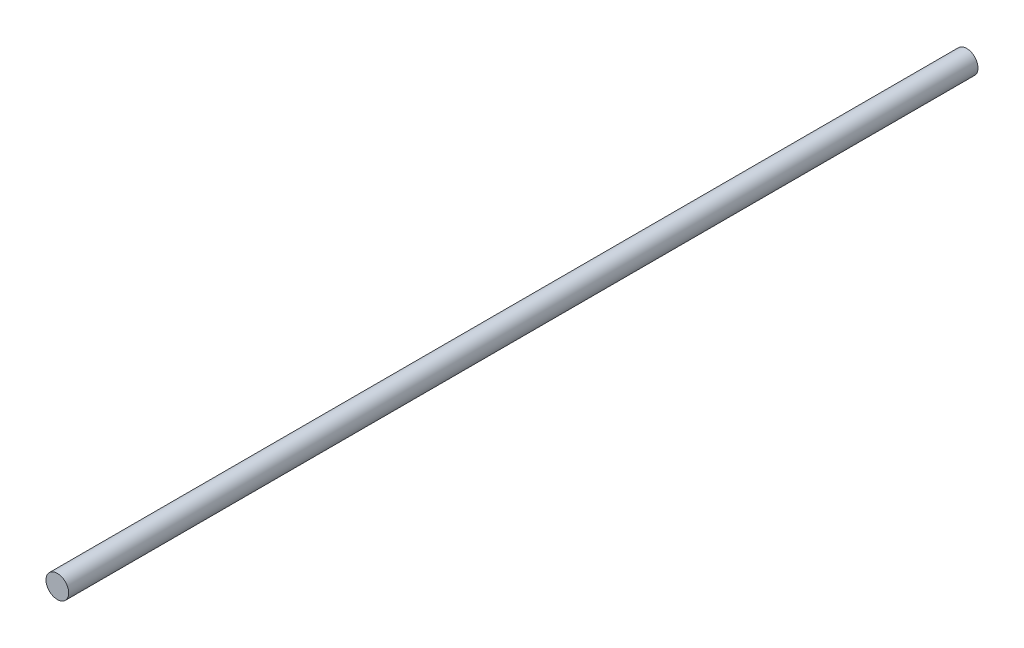
ISO-10303-21;
HEADER;
FILE_DESCRIPTION(('STEP AP214'),'2;1');
FILE_NAME('part.step','',(''),(''),'','','');
FILE_SCHEMA(('AUTOMOTIVE_DESIGN { 1 0 10303 214 1 1 1 1 }'));
ENDSEC;
DATA;
#1=APPLICATION_CONTEXT('core data for automotive mechanical design processes');
#2=APPLICATION_PROTOCOL_DEFINITION('international standard','automotive_design',2000,#1);
#3=PRODUCT_CONTEXT('',#1,'mechanical');
#4=PRODUCT('Part','Part','',(#3));
#5=PRODUCT_RELATED_PRODUCT_CATEGORY('part','',(#4));
#6=PRODUCT_DEFINITION_FORMATION('','',#4);
#7=PRODUCT_DEFINITION_CONTEXT('part definition',#1,'design');
#8=PRODUCT_DEFINITION('design','',#6,#7);
#9=PRODUCT_DEFINITION_SHAPE('','',#8);
#10=(LENGTH_UNIT() NAMED_UNIT(*) SI_UNIT(.MILLI.,.METRE.));
#11=(NAMED_UNIT(*) PLANE_ANGLE_UNIT() SI_UNIT($,.RADIAN.));
#12=(NAMED_UNIT(*) SI_UNIT($,.STERADIAN.) SOLID_ANGLE_UNIT());
#13=UNCERTAINTY_MEASURE_WITH_UNIT(LENGTH_MEASURE(1.E-05),#10,'distance_accuracy_value','');
#14=(GEOMETRIC_REPRESENTATION_CONTEXT(3) GLOBAL_UNCERTAINTY_ASSIGNED_CONTEXT((#13)) GLOBAL_UNIT_ASSIGNED_CONTEXT((#10,
#11,#12)) REPRESENTATION_CONTEXT('',''));
#15=CARTESIAN_POINT('',(0.,0.,0.));
#16=DIRECTION('',(0.,0.,1.));
#17=DIRECTION('',(1.,0.,0.));
#18=AXIS2_PLACEMENT_3D('',#15,#16,#17);
#19=CARTESIAN_POINT('',(0.,0.,240.));
#20=DIRECTION('',(0.,0.,-1.));
#21=DIRECTION('',(-1.,0.,0.));
#22=AXIS2_PLACEMENT_3D('',#19,#20,#21);
#23=CYLINDRICAL_SURFACE('',#22,3.);
#24=CARTESIAN_POINT('',(0.,0.,240.));
#25=DIRECTION('',(0.,0.,1.));
#26=DIRECTION('',(1.,0.,0.));
#27=AXIS2_PLACEMENT_3D('',#24,#25,#26);
#28=CIRCLE('',#27,3.);
#29=CARTESIAN_POINT('',(3.,0.,240.));
#30=VERTEX_POINT('',#29);
#31=EDGE_CURVE('E10',#30,#30,#28,.T.);
#32=ORIENTED_EDGE('',*,*,#31,.F.);
#33=EDGE_LOOP('',(#32));
#34=FACE_BOUND('',#33,.T.);
#35=CARTESIAN_POINT('',(0.,0.,0.));
#36=DIRECTION('',(0.,0.,1.));
#37=DIRECTION('',(1.,0.,0.));
#38=AXIS2_PLACEMENT_3D('',#35,#36,#37);
#39=CIRCLE('',#38,3.);
#40=CARTESIAN_POINT('',(3.,0.,0.));
#41=VERTEX_POINT('',#40);
#42=EDGE_CURVE('E34',#41,#41,#39,.T.);
#43=ORIENTED_EDGE('',*,*,#42,.T.);
#44=EDGE_LOOP('',(#43));
#45=FACE_BOUND('',#44,.T.);
#46=ADVANCED_FACE('F31',(#34,#45),#23,.T.);
#47=CARTESIAN_POINT('',(0.,0.,240.));
#48=DIRECTION('',(0.,0.,1.));
#49=DIRECTION('',(1.,0.,0.));
#50=AXIS2_PLACEMENT_3D('',#47,#48,#49);
#51=PLANE('',#50);
#52=ORIENTED_EDGE('',*,*,#31,.T.);
#53=EDGE_LOOP('',(#52));
#54=FACE_BOUND('',#53,.T.);
#55=ADVANCED_FACE('F46',(#54),#51,.T.);
#56=CARTESIAN_POINT('',(0.,0.,0.));
#57=DIRECTION('',(0.,0.,1.));
#58=DIRECTION('',(1.,0.,0.));
#59=AXIS2_PLACEMENT_3D('',#56,#57,#58);
#60=PLANE('',#59);
#61=ORIENTED_EDGE('',*,*,#42,.F.);
#62=EDGE_LOOP('',(#61));
#63=FACE_BOUND('',#62,.T.);
#64=ADVANCED_FACE('F44',(#63),#60,.F.);
#65=CLOSED_SHELL('',(#46,#55,#64));
#66=MANIFOLD_SOLID_BREP('B2',#65);
#67=ADVANCED_BREP_SHAPE_REPRESENTATION('',(#18,#66),#14);
#68=SHAPE_DEFINITION_REPRESENTATION(#9,#67);
ENDSEC;
END-ISO-10303-21;
